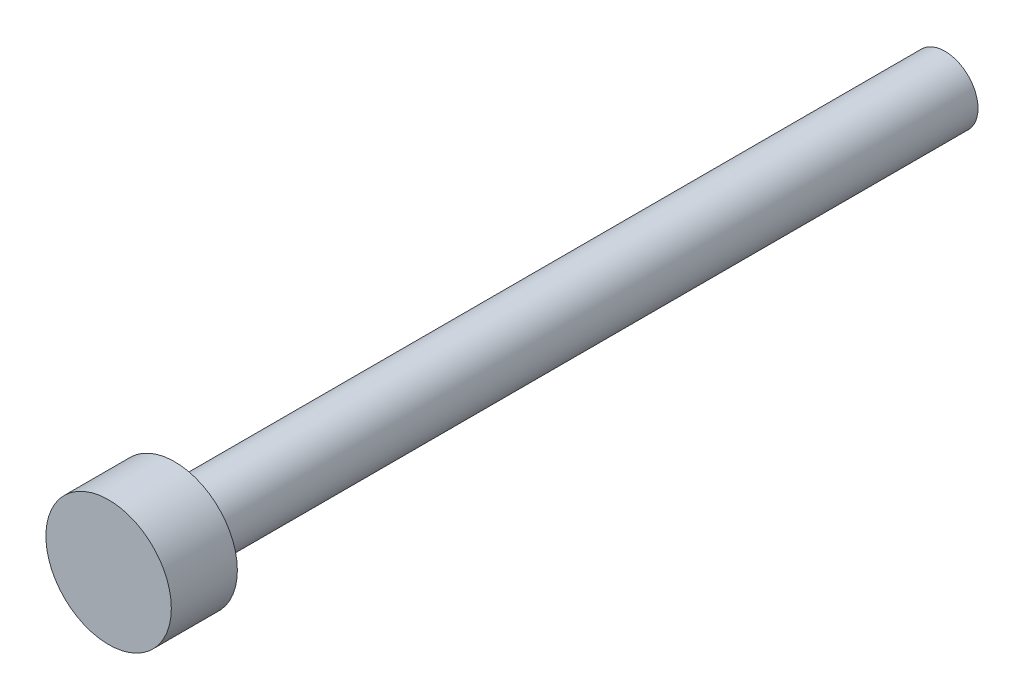
ISO-10303-21;
HEADER;
FILE_DESCRIPTION(('STEP AP214'),'2;1');
FILE_NAME('part.step','',(''),(''),'','','');
FILE_SCHEMA(('AUTOMOTIVE_DESIGN { 1 0 10303 214 1 1 1 1 }'));
ENDSEC;
DATA;
#1=APPLICATION_CONTEXT('core data for automotive mechanical design processes');
#2=APPLICATION_PROTOCOL_DEFINITION('international standard','automotive_design',2000,#1);
#3=PRODUCT_CONTEXT('',#1,'mechanical');
#4=PRODUCT('Part','Part','',(#3));
#5=PRODUCT_RELATED_PRODUCT_CATEGORY('part','',(#4));
#6=PRODUCT_DEFINITION_FORMATION('','',#4);
#7=PRODUCT_DEFINITION_CONTEXT('part definition',#1,'design');
#8=PRODUCT_DEFINITION('design','',#6,#7);
#9=PRODUCT_DEFINITION_SHAPE('','',#8);
#10=(LENGTH_UNIT() NAMED_UNIT(*) SI_UNIT(.MILLI.,.METRE.));
#11=(NAMED_UNIT(*) PLANE_ANGLE_UNIT() SI_UNIT($,.RADIAN.));
#12=(NAMED_UNIT(*) SI_UNIT($,.STERADIAN.) SOLID_ANGLE_UNIT());
#13=UNCERTAINTY_MEASURE_WITH_UNIT(LENGTH_MEASURE(1.E-05),#10,'distance_accuracy_value','');
#14=(GEOMETRIC_REPRESENTATION_CONTEXT(3) GLOBAL_UNCERTAINTY_ASSIGNED_CONTEXT((#13)) GLOBAL_UNIT_ASSIGNED_CONTEXT((#10,
#11,#12)) REPRESENTATION_CONTEXT('',''));
#15=CARTESIAN_POINT('',(0.,0.,0.));
#16=DIRECTION('',(0.,0.,1.));
#17=DIRECTION('',(1.,0.,0.));
#18=AXIS2_PLACEMENT_3D('',#15,#16,#17);
#19=CARTESIAN_POINT('',(0.,0.,35.));
#20=DIRECTION('',(0.,0.,-1.));
#21=DIRECTION('',(-1.,0.,0.));
#22=AXIS2_PLACEMENT_3D('',#19,#20,#21);
#23=CYLINDRICAL_SURFACE('',#22,1.5);
#24=CARTESIAN_POINT('',(0.,0.,35.));
#25=DIRECTION('',(0.,0.,1.));
#26=DIRECTION('',(1.,0.,0.));
#27=AXIS2_PLACEMENT_3D('',#24,#25,#26);
#28=CIRCLE('',#27,1.5);
#29=CARTESIAN_POINT('',(1.5,0.,35.));
#30=VERTEX_POINT('',#29);
#31=EDGE_CURVE('E10',#30,#30,#28,.T.);
#32=ORIENTED_EDGE('',*,*,#31,.F.);
#33=EDGE_LOOP('',(#32));
#34=FACE_BOUND('',#33,.T.);
#35=CARTESIAN_POINT('',(0.,0.,0.));
#36=DIRECTION('',(0.,0.,1.));
#37=DIRECTION('',(1.,0.,0.));
#38=AXIS2_PLACEMENT_3D('',#35,#36,#37);
#39=CIRCLE('',#38,1.5);
#40=CARTESIAN_POINT('',(1.5,0.,0.));
#41=VERTEX_POINT('',#40);
#42=EDGE_CURVE('E34',#41,#41,#39,.T.);
#43=ORIENTED_EDGE('',*,*,#42,.T.);
#44=EDGE_LOOP('',(#43));
#45=FACE_BOUND('',#44,.T.);
#46=ADVANCED_FACE('F31',(#34,#45),#23,.T.);
#47=CARTESIAN_POINT('',(0.,0.,0.));
#48=DIRECTION('',(0.,0.,1.));
#49=DIRECTION('',(1.,0.,0.));
#50=AXIS2_PLACEMENT_3D('',#47,#48,#49);
#51=PLANE('',#50);
#52=ORIENTED_EDGE('',*,*,#42,.F.);
#53=EDGE_LOOP('',(#52));
#54=FACE_BOUND('',#53,.T.);
#55=ADVANCED_FACE('F54',(#54),#51,.F.);
#56=CARTESIAN_POINT('',(0.,0.,38.));
#57=DIRECTION('',(0.,0.,-1.));
#58=DIRECTION('',(-1.,0.,0.));
#59=AXIS2_PLACEMENT_3D('',#56,#57,#58);
#60=CYLINDRICAL_SURFACE('',#59,2.85);
#61=CARTESIAN_POINT('',(0.,0.,38.));
#62=DIRECTION('',(0.,0.,1.));
#63=DIRECTION('',(1.,0.,0.));
#64=AXIS2_PLACEMENT_3D('',#61,#62,#63);
#65=CIRCLE('',#64,2.85);
#66=CARTESIAN_POINT('',(2.85,0.,38.));
#67=VERTEX_POINT('',#66);
#68=EDGE_CURVE('E41',#67,#67,#65,.T.);
#69=ORIENTED_EDGE('',*,*,#68,.F.);
#70=EDGE_LOOP('',(#69));
#71=FACE_BOUND('',#70,.T.);
#72=CARTESIAN_POINT('',(0.,0.,35.));
#73=DIRECTION('',(0.,0.,1.));
#74=DIRECTION('',(1.,0.,0.));
#75=AXIS2_PLACEMENT_3D('',#72,#73,#74);
#76=CIRCLE('',#75,2.85);
#77=CARTESIAN_POINT('',(2.85,0.,35.));
#78=VERTEX_POINT('',#77);
#79=EDGE_CURVE('E43',#78,#78,#76,.T.);
#80=ORIENTED_EDGE('',*,*,#79,.T.);
#81=EDGE_LOOP('',(#80));
#82=FACE_BOUND('',#81,.T.);
#83=ADVANCED_FACE('F51',(#71,#82),#60,.T.);
#84=CARTESIAN_POINT('',(0.,0.,38.));
#85=DIRECTION('',(0.,0.,1.));
#86=DIRECTION('',(1.,0.,0.));
#87=AXIS2_PLACEMENT_3D('',#84,#85,#86);
#88=PLANE('',#87);
#89=ORIENTED_EDGE('',*,*,#68,.T.);
#90=EDGE_LOOP('',(#89));
#91=FACE_BOUND('',#90,.T.);
#92=ADVANCED_FACE('F49',(#91),#88,.T.);
#93=CARTESIAN_POINT('',(0.,0.,35.));
#94=DIRECTION('',(0.,0.,1.));
#95=DIRECTION('',(1.,0.,0.));
#96=AXIS2_PLACEMENT_3D('',#93,#94,#95);
#97=PLANE('',#96);
#98=ORIENTED_EDGE('',*,*,#31,.T.);
#99=EDGE_LOOP('',(#98));
#100=FACE_BOUND('',#99,.T.);
#101=ORIENTED_EDGE('',*,*,#79,.F.);
#102=EDGE_LOOP('',(#101));
#103=FACE_BOUND('',#102,.T.);
#104=ADVANCED_FACE('F58',(#100,#103),#97,.F.);
#105=CLOSED_SHELL('',(#46,#55,#83,#92,#104));
#106=MANIFOLD_SOLID_BREP('B2',#105);
#107=ADVANCED_BREP_SHAPE_REPRESENTATION('',(#18,#106),#14);
#108=SHAPE_DEFINITION_REPRESENTATION(#9,#107);
ENDSEC;
END-ISO-10303-21;
